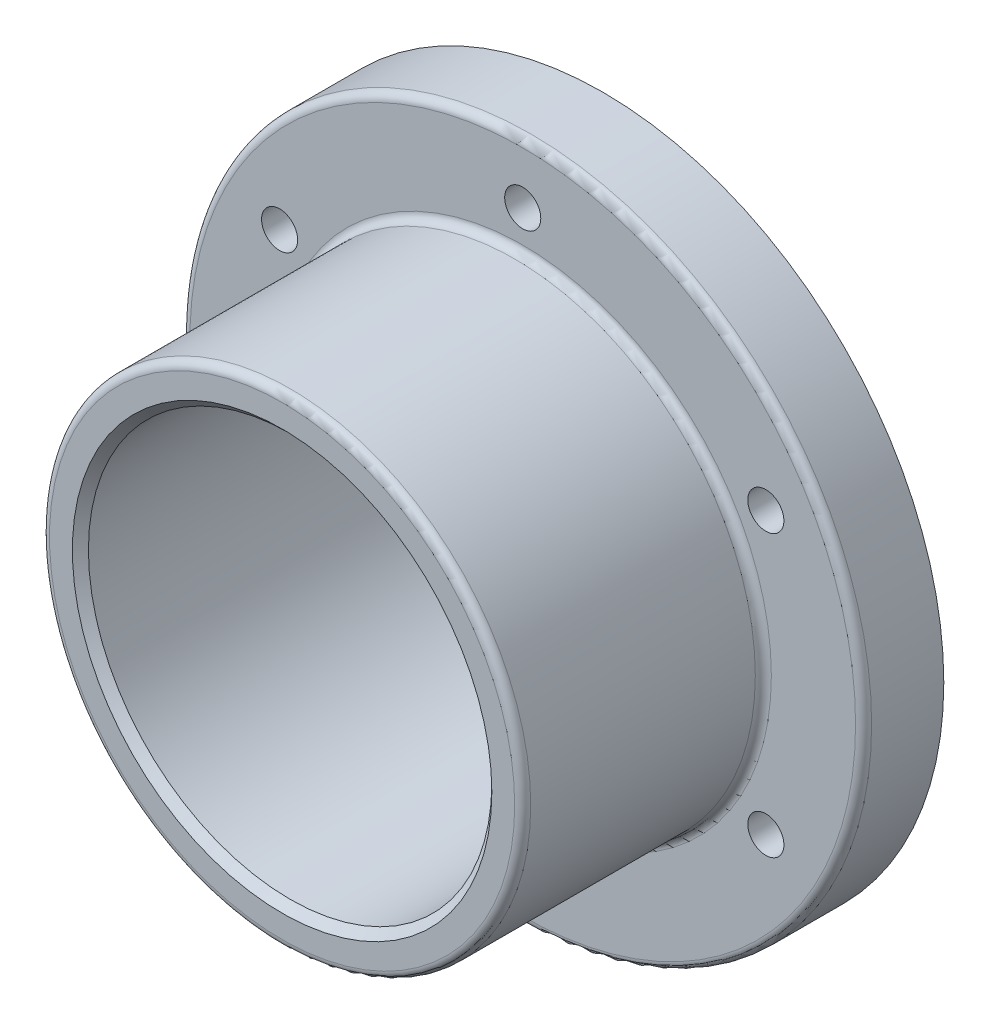
ISO-10303-21;
HEADER;
FILE_DESCRIPTION(('STEP AP214'),'2;1');
FILE_NAME('part.step','',(''),(''),'','','');
FILE_SCHEMA(('AUTOMOTIVE_DESIGN { 1 0 10303 214 1 1 1 1 }'));
ENDSEC;
DATA;
#1=APPLICATION_CONTEXT('core data for automotive mechanical design processes');
#2=APPLICATION_PROTOCOL_DEFINITION('international standard','automotive_design',2000,#1);
#3=PRODUCT_CONTEXT('',#1,'mechanical');
#4=PRODUCT('Part','Part','',(#3));
#5=PRODUCT_RELATED_PRODUCT_CATEGORY('part','',(#4));
#6=PRODUCT_DEFINITION_FORMATION('','',#4);
#7=PRODUCT_DEFINITION_CONTEXT('part definition',#1,'design');
#8=PRODUCT_DEFINITION('design','',#6,#7);
#9=PRODUCT_DEFINITION_SHAPE('','',#8);
#10=(LENGTH_UNIT() NAMED_UNIT(*) SI_UNIT(.MILLI.,.METRE.));
#11=(NAMED_UNIT(*) PLANE_ANGLE_UNIT() SI_UNIT($,.RADIAN.));
#12=(NAMED_UNIT(*) SI_UNIT($,.STERADIAN.) SOLID_ANGLE_UNIT());
#13=UNCERTAINTY_MEASURE_WITH_UNIT(LENGTH_MEASURE(1.E-05),#10,'distance_accuracy_value','');
#14=(GEOMETRIC_REPRESENTATION_CONTEXT(3) GLOBAL_UNCERTAINTY_ASSIGNED_CONTEXT((#13)) GLOBAL_UNIT_ASSIGNED_CONTEXT((#10,
#11,#12)) REPRESENTATION_CONTEXT('',''));
#15=CARTESIAN_POINT('',(0.,0.,0.));
#16=DIRECTION('',(0.,0.,1.));
#17=DIRECTION('',(1.,0.,0.));
#18=AXIS2_PLACEMENT_3D('',#15,#16,#17);
#19=CARTESIAN_POINT('',(0.,0.,10.));
#20=DIRECTION('',(0.,0.,-1.));
#21=DIRECTION('',(-1.,0.,0.));
#22=AXIS2_PLACEMENT_3D('',#19,#20,#21);
#23=CYLINDRICAL_SURFACE('',#22,42.5);
#24=CARTESIAN_POINT('',(0.,0.,9.));
#25=DIRECTION('',(0.,0.,1.));
#26=DIRECTION('',(1.,0.,0.));
#27=AXIS2_PLACEMENT_3D('',#24,#25,#26);
#28=CIRCLE('',#27,42.5);
#29=CARTESIAN_POINT('',(42.5,0.,9.));
#30=VERTEX_POINT('',#29);
#31=EDGE_CURVE('E49',#30,#30,#28,.F.);
#32=ORIENTED_EDGE('',*,*,#31,.T.);
#33=EDGE_LOOP('',(#32));
#34=FACE_BOUND('',#33,.T.);
#35=CARTESIAN_POINT('',(0.,0.,0.));
#36=DIRECTION('',(0.,0.,1.));
#37=DIRECTION('',(1.,0.,0.));
#38=AXIS2_PLACEMENT_3D('',#35,#36,#37);
#39=CIRCLE('',#38,42.5);
#40=CARTESIAN_POINT('',(42.5,0.,0.));
#41=VERTEX_POINT('',#40);
#42=EDGE_CURVE('E89',#41,#41,#39,.T.);
#43=ORIENTED_EDGE('',*,*,#42,.T.);
#44=EDGE_LOOP('',(#43));
#45=FACE_BOUND('',#44,.T.);
#46=ADVANCED_FACE('F41',(#34,#45),#23,.T.);
#47=CARTESIAN_POINT('',(0.,0.,10.));
#48=DIRECTION('',(0.,0.,1.));
#49=DIRECTION('',(1.,0.,0.));
#50=AXIS2_PLACEMENT_3D('',#47,#48,#49);
#51=PLANE('',#50);
#52=CARTESIAN_POINT('',(-30.3108891324552,17.5000000000004,10.));
#53=DIRECTION('',(0.,0.,1.));
#54=DIRECTION('',(0.50000000000001,0.866025403784433,0.));
#55=AXIS2_PLACEMENT_3D('',#52,#53,#54);
#56=CIRCLE('',#55,2.25);
#57=CARTESIAN_POINT('',(-29.1858891324551,19.4485571585153,10.));
#58=VERTEX_POINT('',#57);
#59=EDGE_CURVE('E110',#58,#58,#56,.T.);
#60=ORIENTED_EDGE('',*,*,#59,.F.);
#61=EDGE_LOOP('',(#60));
#62=FACE_BOUND('',#61,.T.);
#63=CARTESIAN_POINT('',(-30.3108891324555,-17.4999999999997,10.));
#64=DIRECTION('',(0.,0.,1.));
#65=DIRECTION('',(-0.499999999999992,0.866025403784443,0.));
#66=AXIS2_PLACEMENT_3D('',#63,#64,#65);
#67=CIRCLE('',#66,2.25);
#68=CARTESIAN_POINT('',(-31.4358891324555,-15.5514428414847,10.));
#69=VERTEX_POINT('',#68);
#70=EDGE_CURVE('E118',#69,#69,#67,.T.);
#71=ORIENTED_EDGE('',*,*,#70,.F.);
#72=EDGE_LOOP('',(#71));
#73=FACE_BOUND('',#72,.T.);
#74=CARTESIAN_POINT('',(0.,-35.,10.));
#75=DIRECTION('',(0.,0.,1.));
#76=DIRECTION('',(-1.,0.,0.));
#77=AXIS2_PLACEMENT_3D('',#74,#75,#76);
#78=CIRCLE('',#77,2.25);
#79=CARTESIAN_POINT('',(-2.25,-35.,10.));
#80=VERTEX_POINT('',#79);
#81=EDGE_CURVE('E126',#80,#80,#78,.T.);
#82=ORIENTED_EDGE('',*,*,#81,.F.);
#83=EDGE_LOOP('',(#82));
#84=FACE_BOUND('',#83,.T.);
#85=CARTESIAN_POINT('',(30.3108891324553,-17.5000000000001,10.));
#86=DIRECTION('',(0.,0.,1.));
#87=DIRECTION('',(-0.500000000000004,-0.866025403784436,0.));
#88=AXIS2_PLACEMENT_3D('',#85,#86,#87);
#89=CIRCLE('',#88,2.25);
#90=CARTESIAN_POINT('',(29.1858891324553,-19.4485571585151,10.));
#91=VERTEX_POINT('',#90);
#92=EDGE_CURVE('E134',#91,#91,#89,.T.);
#93=ORIENTED_EDGE('',*,*,#92,.F.);
#94=EDGE_LOOP('',(#93));
#95=FACE_BOUND('',#94,.T.);
#96=CARTESIAN_POINT('',(30.3108891324554,17.4999999999999,10.));
#97=DIRECTION('',(0.,0.,1.));
#98=DIRECTION('',(0.499999999999998,-0.86602540378444,0.));
#99=AXIS2_PLACEMENT_3D('',#96,#97,#98);
#100=CIRCLE('',#99,2.25);
#101=CARTESIAN_POINT('',(31.4358891324554,15.5514428414849,10.));
#102=VERTEX_POINT('',#101);
#103=EDGE_CURVE('E102',#102,#102,#100,.T.);
#104=ORIENTED_EDGE('',*,*,#103,.F.);
#105=EDGE_LOOP('',(#104));
#106=FACE_BOUND('',#105,.T.);
#107=CARTESIAN_POINT('',(0.,35.,10.));
#108=DIRECTION('',(0.,0.,1.));
#109=DIRECTION('',(1.,0.,0.));
#110=AXIS2_PLACEMENT_3D('',#107,#108,#109);
#111=CIRCLE('',#110,2.25);
#112=CARTESIAN_POINT('',(2.25,35.,10.));
#113=VERTEX_POINT('',#112);
#114=EDGE_CURVE('E94',#113,#113,#111,.T.);
#115=ORIENTED_EDGE('',*,*,#114,.F.);
#116=EDGE_LOOP('',(#115));
#117=FACE_BOUND('',#116,.T.);
#118=CARTESIAN_POINT('',(0.,0.,10.));
#119=DIRECTION('',(0.,0.,1.));
#120=DIRECTION('',(1.,0.,0.));
#121=AXIS2_PLACEMENT_3D('',#118,#119,#120);
#122=CIRCLE('',#121,31.);
#123=CARTESIAN_POINT('',(31.,0.,10.));
#124=VERTEX_POINT('',#123);
#125=EDGE_CURVE('E54',#124,#124,#122,.F.);
#126=ORIENTED_EDGE('',*,*,#125,.T.);
#127=EDGE_LOOP('',(#126));
#128=FACE_BOUND('',#127,.T.);
#129=CARTESIAN_POINT('',(0.,0.,10.));
#130=DIRECTION('',(0.,0.,1.));
#131=DIRECTION('',(1.,0.,0.));
#132=AXIS2_PLACEMENT_3D('',#129,#130,#131);
#133=CIRCLE('',#132,41.5);
#134=CARTESIAN_POINT('',(41.5,0.,10.));
#135=VERTEX_POINT('',#134);
#136=EDGE_CURVE('E59',#135,#135,#133,.T.);
#137=ORIENTED_EDGE('',*,*,#136,.T.);
#138=EDGE_LOOP('',(#137));
#139=FACE_BOUND('',#138,.T.);
#140=ADVANCED_FACE('F153',(#62,#73,#84,#95,#106,#117,#128,#139),#51,.T.);
#141=CARTESIAN_POINT('',(0.,0.,0.));
#142=DIRECTION('',(0.,0.,1.));
#143=DIRECTION('',(1.,0.,0.));
#144=AXIS2_PLACEMENT_3D('',#141,#142,#143);
#145=PLANE('',#144);
#146=CARTESIAN_POINT('',(-30.3108891324552,17.5000000000004,0.));
#147=DIRECTION('',(0.,0.,1.));
#148=DIRECTION('',(0.50000000000001,0.866025403784433,0.));
#149=AXIS2_PLACEMENT_3D('',#146,#147,#148);
#150=CIRCLE('',#149,2.25);
#151=CARTESIAN_POINT('',(-29.1858891324551,19.4485571585153,0.));
#152=VERTEX_POINT('',#151);
#153=EDGE_CURVE('E114',#152,#152,#150,.T.);
#154=ORIENTED_EDGE('',*,*,#153,.T.);
#155=EDGE_LOOP('',(#154));
#156=FACE_BOUND('',#155,.T.);
#157=CARTESIAN_POINT('',(-30.3108891324555,-17.4999999999997,0.));
#158=DIRECTION('',(0.,0.,1.));
#159=DIRECTION('',(-0.499999999999992,0.866025403784443,0.));
#160=AXIS2_PLACEMENT_3D('',#157,#158,#159);
#161=CIRCLE('',#160,2.25);
#162=CARTESIAN_POINT('',(-31.4358891324555,-15.5514428414847,0.));
#163=VERTEX_POINT('',#162);
#164=EDGE_CURVE('E122',#163,#163,#161,.T.);
#165=ORIENTED_EDGE('',*,*,#164,.T.);
#166=EDGE_LOOP('',(#165));
#167=FACE_BOUND('',#166,.T.);
#168=CARTESIAN_POINT('',(0.,-35.,0.));
#169=DIRECTION('',(0.,0.,1.));
#170=DIRECTION('',(-1.,0.,0.));
#171=AXIS2_PLACEMENT_3D('',#168,#169,#170);
#172=CIRCLE('',#171,2.25);
#173=CARTESIAN_POINT('',(-2.25,-35.,0.));
#174=VERTEX_POINT('',#173);
#175=EDGE_CURVE('E130',#174,#174,#172,.T.);
#176=ORIENTED_EDGE('',*,*,#175,.T.);
#177=EDGE_LOOP('',(#176));
#178=FACE_BOUND('',#177,.T.);
#179=CARTESIAN_POINT('',(30.3108891324553,-17.5000000000001,0.));
#180=DIRECTION('',(0.,0.,1.));
#181=DIRECTION('',(-0.500000000000004,-0.866025403784436,0.));
#182=AXIS2_PLACEMENT_3D('',#179,#180,#181);
#183=CIRCLE('',#182,2.25);
#184=CARTESIAN_POINT('',(29.1858891324553,-19.4485571585151,0.));
#185=VERTEX_POINT('',#184);
#186=EDGE_CURVE('E106',#185,#185,#183,.T.);
#187=ORIENTED_EDGE('',*,*,#186,.T.);
#188=EDGE_LOOP('',(#187));
#189=FACE_BOUND('',#188,.T.);
#190=CARTESIAN_POINT('',(30.3108891324554,17.4999999999999,0.));
#191=DIRECTION('',(0.,0.,1.));
#192=DIRECTION('',(0.499999999999998,-0.86602540378444,0.));
#193=AXIS2_PLACEMENT_3D('',#190,#191,#192);
#194=CIRCLE('',#193,2.25);
#195=CARTESIAN_POINT('',(31.4358891324554,15.5514428414849,0.));
#196=VERTEX_POINT('',#195);
#197=EDGE_CURVE('E98',#196,#196,#194,.T.);
#198=ORIENTED_EDGE('',*,*,#197,.T.);
#199=EDGE_LOOP('',(#198));
#200=FACE_BOUND('',#199,.T.);
#201=CARTESIAN_POINT('',(0.,35.,0.));
#202=DIRECTION('',(0.,0.,1.));
#203=DIRECTION('',(1.,0.,0.));
#204=AXIS2_PLACEMENT_3D('',#201,#202,#203);
#205=CIRCLE('',#204,2.25);
#206=CARTESIAN_POINT('',(2.25,35.,0.));
#207=VERTEX_POINT('',#206);
#208=EDGE_CURVE('E93',#207,#207,#205,.T.);
#209=ORIENTED_EDGE('',*,*,#208,.T.);
#210=EDGE_LOOP('',(#209));
#211=FACE_BOUND('',#210,.T.);
#212=CARTESIAN_POINT('',(0.,0.,0.));
#213=DIRECTION('',(0.,0.,1.));
#214=DIRECTION('',(1.,0.,0.));
#215=AXIS2_PLACEMENT_3D('',#212,#213,#214);
#216=CIRCLE('',#215,26.15);
#217=CARTESIAN_POINT('',(26.15,0.,0.));
#218=VERTEX_POINT('',#217);
#219=EDGE_CURVE('E73',#218,#218,#216,.T.);
#220=ORIENTED_EDGE('',*,*,#219,.T.);
#221=EDGE_LOOP('',(#220));
#222=FACE_BOUND('',#221,.T.);
#223=ORIENTED_EDGE('',*,*,#42,.F.);
#224=EDGE_LOOP('',(#223));
#225=FACE_BOUND('',#224,.T.);
#226=ADVANCED_FACE('F142',(#156,#167,#178,#189,#200,#211,#222,#225),#145,.F.);
#227=CARTESIAN_POINT('',(0.,0.,40.));
#228=DIRECTION('',(0.,0.,-1.));
#229=DIRECTION('',(-1.,0.,0.));
#230=AXIS2_PLACEMENT_3D('',#227,#228,#229);
#231=CYLINDRICAL_SURFACE('',#230,30.);
#232=CARTESIAN_POINT('',(0.,0.,11.));
#233=DIRECTION('',(0.,0.,1.));
#234=DIRECTION('',(1.,0.,0.));
#235=AXIS2_PLACEMENT_3D('',#232,#233,#234);
#236=CIRCLE('',#235,30.);
#237=CARTESIAN_POINT('',(30.,0.,11.));
#238=VERTEX_POINT('',#237);
#239=EDGE_CURVE('E65',#238,#238,#236,.T.);
#240=ORIENTED_EDGE('',*,*,#239,.T.);
#241=EDGE_LOOP('',(#240));
#242=FACE_BOUND('',#241,.T.);
#243=CARTESIAN_POINT('',(0.,0.,39.));
#244=DIRECTION('',(0.,0.,1.));
#245=DIRECTION('',(1.,0.,0.));
#246=AXIS2_PLACEMENT_3D('',#243,#244,#245);
#247=CIRCLE('',#246,30.);
#248=CARTESIAN_POINT('',(30.,0.,39.));
#249=VERTEX_POINT('',#248);
#250=EDGE_CURVE('E69',#249,#249,#247,.F.);
#251=ORIENTED_EDGE('',*,*,#250,.T.);
#252=EDGE_LOOP('',(#251));
#253=FACE_BOUND('',#252,.T.);
#254=ADVANCED_FACE('F207',(#242,#253),#231,.T.);
#255=CARTESIAN_POINT('',(0.,0.,40.));
#256=DIRECTION('',(0.,0.,1.));
#257=DIRECTION('',(1.,0.,0.));
#258=AXIS2_PLACEMENT_3D('',#255,#256,#257);
#259=PLANE('',#258);
#260=CARTESIAN_POINT('',(0.,0.,40.));
#261=DIRECTION('',(0.,0.,1.));
#262=DIRECTION('',(1.,0.,0.));
#263=AXIS2_PLACEMENT_3D('',#260,#261,#262);
#264=CIRCLE('',#263,29.);
#265=CARTESIAN_POINT('',(29.,0.,40.));
#266=VERTEX_POINT('',#265);
#267=EDGE_CURVE('E10',#266,#266,#264,.T.);
#268=ORIENTED_EDGE('',*,*,#267,.T.);
#269=EDGE_LOOP('',(#268));
#270=FACE_BOUND('',#269,.T.);
#271=CARTESIAN_POINT('',(0.,0.,40.));
#272=DIRECTION('',(0.,0.,1.));
#273=DIRECTION('',(1.,0.,0.));
#274=AXIS2_PLACEMENT_3D('',#271,#272,#273);
#275=CIRCLE('',#274,26.15);
#276=CARTESIAN_POINT('',(26.15,0.,40.));
#277=VERTEX_POINT('',#276);
#278=EDGE_CURVE('E77',#277,#277,#275,.F.);
#279=ORIENTED_EDGE('',*,*,#278,.T.);
#280=EDGE_LOOP('',(#279));
#281=FACE_BOUND('',#280,.T.);
#282=ADVANCED_FACE('F213',(#270,#281),#259,.T.);
#283=CARTESIAN_POINT('',(0.,0.,0.));
#284=DIRECTION('',(0.,0.,1.));
#285=DIRECTION('',(1.,0.,0.));
#286=AXIS2_PLACEMENT_3D('',#283,#284,#285);
#287=CYLINDRICAL_SURFACE('',#286,25.15);
#288=CARTESIAN_POINT('',(0.,0.,39.));
#289=DIRECTION('',(0.,0.,1.));
#290=DIRECTION('',(1.,0.,0.));
#291=AXIS2_PLACEMENT_3D('',#288,#289,#290);
#292=CIRCLE('',#291,25.15);
#293=CARTESIAN_POINT('',(25.15,0.,39.));
#294=VERTEX_POINT('',#293);
#295=EDGE_CURVE('E81',#294,#294,#292,.T.);
#296=ORIENTED_EDGE('',*,*,#295,.T.);
#297=EDGE_LOOP('',(#296));
#298=FACE_BOUND('',#297,.T.);
#299=CARTESIAN_POINT('',(0.,0.,1.));
#300=DIRECTION('',(0.,0.,1.));
#301=DIRECTION('',(1.,0.,0.));
#302=AXIS2_PLACEMENT_3D('',#299,#300,#301);
#303=CIRCLE('',#302,25.15);
#304=CARTESIAN_POINT('',(25.15,0.,1.));
#305=VERTEX_POINT('',#304);
#306=EDGE_CURVE('E85',#305,#305,#303,.F.);
#307=ORIENTED_EDGE('',*,*,#306,.T.);
#308=EDGE_LOOP('',(#307));
#309=FACE_BOUND('',#308,.T.);
#310=ADVANCED_FACE('F193',(#298,#309),#287,.F.);
#311=CARTESIAN_POINT('',(0.,0.,39.));
#312=DIRECTION('',(0.,0.,1.));
#313=DIRECTION('',(1.,0.,0.));
#314=AXIS2_PLACEMENT_3D('',#311,#312,#313);
#315=CONICAL_SURFACE('',#314,25.15,0.78539816339746);
#316=ORIENTED_EDGE('',*,*,#278,.F.);
#317=EDGE_LOOP('',(#316));
#318=FACE_BOUND('',#317,.T.);
#319=ORIENTED_EDGE('',*,*,#295,.F.);
#320=EDGE_LOOP('',(#319));
#321=FACE_BOUND('',#320,.T.);
#322=ADVANCED_FACE('F187',(#318,#321),#315,.F.);
#323=CARTESIAN_POINT('',(0.,0.,0.));
#324=DIRECTION('',(0.,0.,-1.));
#325=DIRECTION('',(-1.,0.,0.));
#326=AXIS2_PLACEMENT_3D('',#323,#324,#325);
#327=CONICAL_SURFACE('',#326,26.15,0.785398163397445);
#328=ORIENTED_EDGE('',*,*,#306,.F.);
#329=EDGE_LOOP('',(#328));
#330=FACE_BOUND('',#329,.T.);
#331=ORIENTED_EDGE('',*,*,#219,.F.);
#332=EDGE_LOOP('',(#331));
#333=FACE_BOUND('',#332,.T.);
#334=ADVANCED_FACE('F176',(#330,#333),#327,.F.);
#335=CARTESIAN_POINT('',(0.,0.,11.));
#336=DIRECTION('',(0.,0.,1.));
#337=DIRECTION('',(1.,0.,0.));
#338=AXIS2_PLACEMENT_3D('',#335,#336,#337);
#339=TOROIDAL_SURFACE('',#338,31.,1.);
#340=ORIENTED_EDGE('',*,*,#125,.F.);
#341=EDGE_LOOP('',(#340));
#342=FACE_BOUND('',#341,.T.);
#343=ORIENTED_EDGE('',*,*,#239,.F.);
#344=EDGE_LOOP('',(#343));
#345=FACE_BOUND('',#344,.T.);
#346=ADVANCED_FACE('F168',(#342,#345),#339,.F.);
#347=CARTESIAN_POINT('',(0.,0.,9.));
#348=DIRECTION('',(0.,0.,1.));
#349=DIRECTION('',(1.,0.,0.));
#350=AXIS2_PLACEMENT_3D('',#347,#348,#349);
#351=TOROIDAL_SURFACE('',#350,41.5,1.);
#352=ORIENTED_EDGE('',*,*,#31,.F.);
#353=EDGE_LOOP('',(#352));
#354=FACE_BOUND('',#353,.T.);
#355=ORIENTED_EDGE('',*,*,#136,.F.);
#356=EDGE_LOOP('',(#355));
#357=FACE_BOUND('',#356,.T.);
#358=ADVANCED_FACE('F166',(#354,#357),#351,.T.);
#359=CARTESIAN_POINT('',(0.,0.,39.));
#360=DIRECTION('',(0.,0.,1.));
#361=DIRECTION('',(1.,0.,0.));
#362=AXIS2_PLACEMENT_3D('',#359,#360,#361);
#363=TOROIDAL_SURFACE('',#362,29.,1.);
#364=ORIENTED_EDGE('',*,*,#250,.F.);
#365=EDGE_LOOP('',(#364));
#366=FACE_BOUND('',#365,.T.);
#367=ORIENTED_EDGE('',*,*,#267,.F.);
#368=EDGE_LOOP('',(#367));
#369=FACE_BOUND('',#368,.T.);
#370=ADVANCED_FACE('F43',(#366,#369),#363,.T.);
#371=CARTESIAN_POINT('',(0.,35.,0.));
#372=DIRECTION('',(0.,0.,1.));
#373=DIRECTION('',(1.,0.,0.));
#374=AXIS2_PLACEMENT_3D('',#371,#372,#373);
#375=CYLINDRICAL_SURFACE('',#374,2.25);
#376=ORIENTED_EDGE('',*,*,#208,.F.);
#377=EDGE_LOOP('',(#376));
#378=FACE_BOUND('',#377,.T.);
#379=ORIENTED_EDGE('',*,*,#114,.T.);
#380=EDGE_LOOP('',(#379));
#381=FACE_BOUND('',#380,.T.);
#382=ADVANCED_FACE('F174',(#378,#381),#375,.F.);
#383=CARTESIAN_POINT('',(30.3108891324554,17.4999999999999,0.));
#384=DIRECTION('',(0.,0.,1.));
#385=DIRECTION('',(1.,0.,0.));
#386=AXIS2_PLACEMENT_3D('',#383,#384,#385);
#387=CYLINDRICAL_SURFACE('',#386,2.25);
#388=ORIENTED_EDGE('',*,*,#197,.F.);
#389=EDGE_LOOP('',(#388));
#390=FACE_BOUND('',#389,.T.);
#391=ORIENTED_EDGE('',*,*,#103,.T.);
#392=EDGE_LOOP('',(#391));
#393=FACE_BOUND('',#392,.T.);
#394=ADVANCED_FACE('F149',(#390,#393),#387,.F.);
#395=CARTESIAN_POINT('',(30.3108891324553,-17.5000000000001,0.));
#396=DIRECTION('',(0.,0.,1.));
#397=DIRECTION('',(1.,0.,0.));
#398=AXIS2_PLACEMENT_3D('',#395,#396,#397);
#399=CYLINDRICAL_SURFACE('',#398,2.25);
#400=ORIENTED_EDGE('',*,*,#186,.F.);
#401=EDGE_LOOP('',(#400));
#402=FACE_BOUND('',#401,.T.);
#403=ORIENTED_EDGE('',*,*,#92,.T.);
#404=EDGE_LOOP('',(#403));
#405=FACE_BOUND('',#404,.T.);
#406=ADVANCED_FACE('F145',(#402,#405),#399,.F.);
#407=CARTESIAN_POINT('',(0.,-35.,0.));
#408=DIRECTION('',(0.,0.,1.));
#409=DIRECTION('',(1.,0.,0.));
#410=AXIS2_PLACEMENT_3D('',#407,#408,#409);
#411=CYLINDRICAL_SURFACE('',#410,2.25);
#412=ORIENTED_EDGE('',*,*,#175,.F.);
#413=EDGE_LOOP('',(#412));
#414=FACE_BOUND('',#413,.T.);
#415=ORIENTED_EDGE('',*,*,#81,.T.);
#416=EDGE_LOOP('',(#415));
#417=FACE_BOUND('',#416,.T.);
#418=ADVANCED_FACE('F148',(#414,#417),#411,.F.);
#419=CARTESIAN_POINT('',(-30.3108891324555,-17.4999999999997,0.));
#420=DIRECTION('',(0.,0.,1.));
#421=DIRECTION('',(1.,0.,0.));
#422=AXIS2_PLACEMENT_3D('',#419,#420,#421);
#423=CYLINDRICAL_SURFACE('',#422,2.25);
#424=ORIENTED_EDGE('',*,*,#164,.F.);
#425=EDGE_LOOP('',(#424));
#426=FACE_BOUND('',#425,.T.);
#427=ORIENTED_EDGE('',*,*,#70,.T.);
#428=EDGE_LOOP('',(#427));
#429=FACE_BOUND('',#428,.T.);
#430=ADVANCED_FACE('F224',(#426,#429),#423,.F.);
#431=CARTESIAN_POINT('',(-30.3108891324552,17.5000000000004,0.));
#432=DIRECTION('',(0.,0.,1.));
#433=DIRECTION('',(1.,0.,0.));
#434=AXIS2_PLACEMENT_3D('',#431,#432,#433);
#435=CYLINDRICAL_SURFACE('',#434,2.25);
#436=ORIENTED_EDGE('',*,*,#153,.F.);
#437=EDGE_LOOP('',(#436));
#438=FACE_BOUND('',#437,.T.);
#439=ORIENTED_EDGE('',*,*,#59,.T.);
#440=EDGE_LOOP('',(#439));
#441=FACE_BOUND('',#440,.T.);
#442=ADVANCED_FACE('F231',(#438,#441),#435,.F.);
#443=CLOSED_SHELL('',(#46,#140,#226,#254,#282,#310,#322,#334,#346,#358,#370,#382,#394,#406,#418,
#430,#442));
#444=MANIFOLD_SOLID_BREP('B2',#443);
#445=ADVANCED_BREP_SHAPE_REPRESENTATION('',(#18,#444),#14);
#446=SHAPE_DEFINITION_REPRESENTATION(#9,#445);
ENDSEC;
END-ISO-10303-21;
